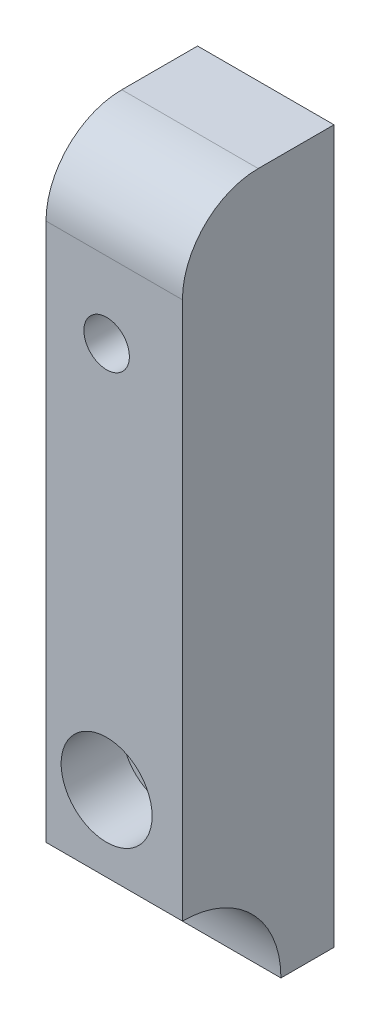
ISO-10303-21;
HEADER;
FILE_DESCRIPTION(('STEP AP214'),'2;1');
FILE_NAME('part.step','',(''),(''),'','','');
FILE_SCHEMA(('AUTOMOTIVE_DESIGN { 1 0 10303 214 1 1 1 1 }'));
ENDSEC;
DATA;
#1=APPLICATION_CONTEXT('core data for automotive mechanical design processes');
#2=APPLICATION_PROTOCOL_DEFINITION('international standard','automotive_design',2000,#1);
#3=PRODUCT_CONTEXT('',#1,'mechanical');
#4=PRODUCT('Part','Part','',(#3));
#5=PRODUCT_RELATED_PRODUCT_CATEGORY('part','',(#4));
#6=PRODUCT_DEFINITION_FORMATION('','',#4);
#7=PRODUCT_DEFINITION_CONTEXT('part definition',#1,'design');
#8=PRODUCT_DEFINITION('design','',#6,#7);
#9=PRODUCT_DEFINITION_SHAPE('','',#8);
#10=(LENGTH_UNIT() NAMED_UNIT(*) SI_UNIT(.MILLI.,.METRE.));
#11=(NAMED_UNIT(*) PLANE_ANGLE_UNIT() SI_UNIT($,.RADIAN.));
#12=(NAMED_UNIT(*) SI_UNIT($,.STERADIAN.) SOLID_ANGLE_UNIT());
#13=UNCERTAINTY_MEASURE_WITH_UNIT(LENGTH_MEASURE(1.E-05),#10,'distance_accuracy_value','');
#14=(GEOMETRIC_REPRESENTATION_CONTEXT(3) GLOBAL_UNCERTAINTY_ASSIGNED_CONTEXT((#13)) GLOBAL_UNIT_ASSIGNED_CONTEXT((#10,
#11,#12)) REPRESENTATION_CONTEXT('',''));
#15=CARTESIAN_POINT('',(0.,0.,0.));
#16=DIRECTION('',(0.,0.,1.));
#17=DIRECTION('',(1.,0.,0.));
#18=AXIS2_PLACEMENT_3D('',#15,#16,#17);
#19=CARTESIAN_POINT('',(5.,11.5,0.));
#20=DIRECTION('',(0.,0.,1.));
#21=DIRECTION('',(1.,0.,0.));
#22=AXIS2_PLACEMENT_3D('',#19,#20,#21);
#23=CYLINDRICAL_SURFACE('',#22,1.5);
#24=CARTESIAN_POINT('',(5.,11.5,0.));
#25=DIRECTION('',(0.,0.,1.));
#26=DIRECTION('',(1.,0.,0.));
#27=AXIS2_PLACEMENT_3D('',#24,#25,#26);
#28=CIRCLE('',#27,1.5);
#29=CARTESIAN_POINT('',(6.5,11.5,0.));
#30=VERTEX_POINT('',#29);
#31=EDGE_CURVE('E112',#30,#30,#28,.T.);
#32=ORIENTED_EDGE('',*,*,#31,.F.);
#33=EDGE_LOOP('',(#32));
#34=FACE_BOUND('',#33,.T.);
#35=CARTESIAN_POINT('',(5.,11.5,6.));
#36=DIRECTION('',(0.,0.,1.));
#37=DIRECTION('',(1.,0.,0.));
#38=AXIS2_PLACEMENT_3D('',#35,#36,#37);
#39=CIRCLE('',#38,1.5);
#40=CARTESIAN_POINT('',(6.5,11.5,6.));
#41=VERTEX_POINT('',#40);
#42=EDGE_CURVE('E36',#41,#41,#39,.F.);
#43=ORIENTED_EDGE('',*,*,#42,.F.);
#44=EDGE_LOOP('',(#43));
#45=FACE_BOUND('',#44,.T.);
#46=ADVANCED_FACE('F32',(#34,#45),#23,.F.);
#47=CARTESIAN_POINT('',(0.,42.,5.));
#48=DIRECTION('',(-1.,0.,0.));
#49=DIRECTION('',(0.,0.,1.));
#50=AXIS2_PLACEMENT_3D('',#47,#48,#49);
#51=CYLINDRICAL_SURFACE('',#50,5.);
#52=DIRECTION('',(-1.,0.,0.));
#53=VECTOR('',#52,1.);
#54=CARTESIAN_POINT('',(0.,47.,5.));
#55=LINE('',#54,#53);
#56=CARTESIAN_POINT('',(1.,47.,5.));
#57=VERTEX_POINT('',#56);
#58=CARTESIAN_POINT('',(10.,47.,5.));
#59=VERTEX_POINT('',#58);
#60=EDGE_CURVE('E41',#57,#59,#55,.F.);
#61=ORIENTED_EDGE('',*,*,#60,.F.);
#62=CARTESIAN_POINT('',(1.,42.,5.));
#63=DIRECTION('',(-1.,0.,0.));
#64=DIRECTION('',(0.,0.,1.));
#65=AXIS2_PLACEMENT_3D('',#62,#63,#64);
#66=CIRCLE('',#65,5.);
#67=CARTESIAN_POINT('',(1.,42.,10.));
#68=VERTEX_POINT('',#67);
#69=EDGE_CURVE('E109',#57,#68,#66,.F.);
#70=ORIENTED_EDGE('',*,*,#69,.T.);
#71=DIRECTION('',(-1.,0.,0.));
#72=VECTOR('',#71,1.);
#73=CARTESIAN_POINT('',(0.,42.,10.));
#74=LINE('',#73,#72);
#75=CARTESIAN_POINT('',(10.,42.,10.));
#76=VERTEX_POINT('',#75);
#77=EDGE_CURVE('E134',#76,#68,#74,.T.);
#78=ORIENTED_EDGE('',*,*,#77,.F.);
#79=CARTESIAN_POINT('',(10.,42.,5.));
#80=DIRECTION('',(-1.,0.,0.));
#81=DIRECTION('',(0.,0.,1.));
#82=AXIS2_PLACEMENT_3D('',#79,#80,#81);
#83=CIRCLE('',#82,5.);
#84=EDGE_CURVE('E11',#59,#76,#83,.F.);
#85=ORIENTED_EDGE('',*,*,#84,.F.);
#86=EDGE_LOOP('',(#61,#70,#78,#85));
#87=FACE_BOUND('',#86,.T.);
#88=ADVANCED_FACE('F34',(#87),#51,.T.);
#89=CARTESIAN_POINT('',(0.,0.,10.));
#90=DIRECTION('',(0.,1.,0.));
#91=DIRECTION('',(0.,0.,1.));
#92=AXIS2_PLACEMENT_3D('',#89,#90,#91);
#93=PLANE('',#92);
#94=DIRECTION('',(0.,0.,-1.));
#95=VECTOR('',#94,1.);
#96=CARTESIAN_POINT('',(10.,0.,10.));
#97=LINE('',#96,#95);
#98=CARTESIAN_POINT('',(10.,0.,3.5));
#99=VERTEX_POINT('',#98);
#100=CARTESIAN_POINT('',(10.,0.,0.));
#101=VERTEX_POINT('',#100);
#102=EDGE_CURVE('E99',#99,#101,#97,.T.);
#103=ORIENTED_EDGE('',*,*,#102,.F.);
#104=DIRECTION('',(-1.,0.,0.));
#105=VECTOR('',#104,1.);
#106=CARTESIAN_POINT('',(23.,0.,3.5));
#107=LINE('',#106,#105);
#108=CARTESIAN_POINT('',(1.,0.,3.5));
#109=VERTEX_POINT('',#108);
#110=EDGE_CURVE('E86',#99,#109,#107,.T.);
#111=ORIENTED_EDGE('',*,*,#110,.T.);
#112=DIRECTION('',(0.,0.,1.));
#113=VECTOR('',#112,1.);
#114=CARTESIAN_POINT('',(1.,0.,0.));
#115=LINE('',#114,#113);
#116=CARTESIAN_POINT('',(1.,0.,0.));
#117=VERTEX_POINT('',#116);
#118=EDGE_CURVE('E97',#117,#109,#115,.T.);
#119=ORIENTED_EDGE('',*,*,#118,.F.);
#120=DIRECTION('',(1.,0.,0.));
#121=VECTOR('',#120,1.);
#122=CARTESIAN_POINT('',(0.,0.,0.));
#123=LINE('',#122,#121);
#124=EDGE_CURVE('E119',#117,#101,#123,.T.);
#125=ORIENTED_EDGE('',*,*,#124,.T.);
#126=EDGE_LOOP('',(#103,#111,#119,#125));
#127=FACE_BOUND('',#126,.T.);
#128=ADVANCED_FACE('F95',(#127),#93,.F.);
#129=CARTESIAN_POINT('',(0.,47.,10.));
#130=DIRECTION('',(0.,-1.,0.));
#131=DIRECTION('',(0.,0.,-1.));
#132=AXIS2_PLACEMENT_3D('',#129,#130,#131);
#133=PLANE('',#132);
#134=DIRECTION('',(0.,0.,-1.));
#135=VECTOR('',#134,1.);
#136=CARTESIAN_POINT('',(1.,47.,0.));
#137=LINE('',#136,#135);
#138=CARTESIAN_POINT('',(1.,47.,0.));
#139=VERTEX_POINT('',#138);
#140=EDGE_CURVE('E56',#57,#139,#137,.T.);
#141=ORIENTED_EDGE('',*,*,#140,.F.);
#142=ORIENTED_EDGE('',*,*,#60,.T.);
#143=DIRECTION('',(0.,0.,-1.));
#144=VECTOR('',#143,1.);
#145=CARTESIAN_POINT('',(10.,47.,10.));
#146=LINE('',#145,#144);
#147=CARTESIAN_POINT('',(10.,47.,0.));
#148=VERTEX_POINT('',#147);
#149=EDGE_CURVE('E124',#59,#148,#146,.T.);
#150=ORIENTED_EDGE('',*,*,#149,.T.);
#151=DIRECTION('',(-1.,0.,0.));
#152=VECTOR('',#151,1.);
#153=CARTESIAN_POINT('',(0.,47.,0.));
#154=LINE('',#153,#152);
#155=EDGE_CURVE('E125',#148,#139,#154,.T.);
#156=ORIENTED_EDGE('',*,*,#155,.T.);
#157=EDGE_LOOP('',(#141,#142,#150,#156));
#158=FACE_BOUND('',#157,.T.);
#159=ADVANCED_FACE('F140',(#158),#133,.F.);
#160=CARTESIAN_POINT('',(0.,0.,10.));
#161=DIRECTION('',(0.,0.,-1.));
#162=DIRECTION('',(-1.,0.,0.));
#163=AXIS2_PLACEMENT_3D('',#160,#161,#162);
#164=PLANE('',#163);
#165=CARTESIAN_POINT('',(5.,11.5,10.));
#166=DIRECTION('',(0.,0.,1.));
#167=DIRECTION('',(1.,0.,0.));
#168=AXIS2_PLACEMENT_3D('',#165,#166,#167);
#169=CIRCLE('',#168,3.);
#170=CARTESIAN_POINT('',(8.,11.5,10.));
#171=VERTEX_POINT('',#170);
#172=EDGE_CURVE('E189',#171,#171,#169,.T.);
#173=ORIENTED_EDGE('',*,*,#172,.F.);
#174=EDGE_LOOP('',(#173));
#175=FACE_BOUND('',#174,.T.);
#176=CARTESIAN_POINT('',(5.,37.,10.));
#177=DIRECTION('',(0.,0.,1.));
#178=DIRECTION('',(1.,0.,0.));
#179=AXIS2_PLACEMENT_3D('',#176,#177,#178);
#180=CIRCLE('',#179,1.5);
#181=CARTESIAN_POINT('',(6.5,37.,10.));
#182=VERTEX_POINT('',#181);
#183=EDGE_CURVE('E115',#182,#182,#180,.T.);
#184=ORIENTED_EDGE('',*,*,#183,.F.);
#185=EDGE_LOOP('',(#184));
#186=FACE_BOUND('',#185,.T.);
#187=DIRECTION('',(0.,1.,0.));
#188=VECTOR('',#187,1.);
#189=CARTESIAN_POINT('',(1.,47.,10.));
#190=LINE('',#189,#188);
#191=CARTESIAN_POINT('',(1.,6.5,10.));
#192=VERTEX_POINT('',#191);
#193=EDGE_CURVE('E103',#192,#68,#190,.T.);
#194=ORIENTED_EDGE('',*,*,#193,.F.);
#195=DIRECTION('',(-1.,0.,0.));
#196=VECTOR('',#195,1.);
#197=CARTESIAN_POINT('',(23.,6.5,10.));
#198=LINE('',#197,#196);
#199=CARTESIAN_POINT('',(10.,6.5,10.));
#200=VERTEX_POINT('',#199);
#201=EDGE_CURVE('E48',#192,#200,#198,.F.);
#202=ORIENTED_EDGE('',*,*,#201,.T.);
#203=DIRECTION('',(0.,1.,0.));
#204=VECTOR('',#203,1.);
#205=CARTESIAN_POINT('',(10.,0.,10.));
#206=LINE('',#205,#204);
#207=EDGE_CURVE('E122',#200,#76,#206,.T.);
#208=ORIENTED_EDGE('',*,*,#207,.T.);
#209=ORIENTED_EDGE('',*,*,#77,.T.);
#210=EDGE_LOOP('',(#194,#202,#208,#209));
#211=FACE_BOUND('',#210,.T.);
#212=ADVANCED_FACE('F152',(#175,#186,#211),#164,.F.);
#213=CARTESIAN_POINT('',(0.,0.,0.));
#214=DIRECTION('',(0.,0.,-1.));
#215=DIRECTION('',(-1.,0.,0.));
#216=AXIS2_PLACEMENT_3D('',#213,#214,#215);
#217=PLANE('',#216);
#218=ORIENTED_EDGE('',*,*,#31,.T.);
#219=EDGE_LOOP('',(#218));
#220=FACE_BOUND('',#219,.T.);
#221=CARTESIAN_POINT('',(5.,37.,0.));
#222=DIRECTION('',(0.,0.,1.));
#223=DIRECTION('',(1.,0.,0.));
#224=AXIS2_PLACEMENT_3D('',#221,#222,#223);
#225=CIRCLE('',#224,1.5);
#226=CARTESIAN_POINT('',(6.5,37.,0.));
#227=VERTEX_POINT('',#226);
#228=EDGE_CURVE('E116',#227,#227,#225,.T.);
#229=ORIENTED_EDGE('',*,*,#228,.T.);
#230=EDGE_LOOP('',(#229));
#231=FACE_BOUND('',#230,.T.);
#232=ORIENTED_EDGE('',*,*,#124,.F.);
#233=DIRECTION('',(0.,-1.,0.));
#234=VECTOR('',#233,1.);
#235=CARTESIAN_POINT('',(1.,47.,0.));
#236=LINE('',#235,#234);
#237=EDGE_CURVE('E100',#139,#117,#236,.T.);
#238=ORIENTED_EDGE('',*,*,#237,.F.);
#239=ORIENTED_EDGE('',*,*,#155,.F.);
#240=DIRECTION('',(0.,1.,0.));
#241=VECTOR('',#240,1.);
#242=CARTESIAN_POINT('',(10.,0.,0.));
#243=LINE('',#242,#241);
#244=EDGE_CURVE('E127',#101,#148,#243,.T.);
#245=ORIENTED_EDGE('',*,*,#244,.F.);
#246=EDGE_LOOP('',(#232,#238,#239,#245));
#247=FACE_BOUND('',#246,.T.);
#248=ADVANCED_FACE('F150',(#220,#231,#247),#217,.T.);
#249=CARTESIAN_POINT('',(10.,0.,10.));
#250=DIRECTION('',(-1.,0.,0.));
#251=DIRECTION('',(0.,0.,1.));
#252=AXIS2_PLACEMENT_3D('',#249,#250,#251);
#253=PLANE('',#252);
#254=ORIENTED_EDGE('',*,*,#207,.F.);
#255=CARTESIAN_POINT('',(10.,0.,10.));
#256=DIRECTION('',(-1.,0.,0.));
#257=DIRECTION('',(0.,0.,1.));
#258=AXIS2_PLACEMENT_3D('',#255,#256,#257);
#259=CIRCLE('',#258,6.5);
#260=EDGE_CURVE('E90',#200,#99,#259,.T.);
#261=ORIENTED_EDGE('',*,*,#260,.T.);
#262=ORIENTED_EDGE('',*,*,#102,.T.);
#263=ORIENTED_EDGE('',*,*,#244,.T.);
#264=ORIENTED_EDGE('',*,*,#149,.F.);
#265=ORIENTED_EDGE('',*,*,#84,.T.);
#266=EDGE_LOOP('',(#254,#261,#262,#263,#264,#265));
#267=FACE_BOUND('',#266,.T.);
#268=ADVANCED_FACE('F146',(#267),#253,.F.);
#269=CARTESIAN_POINT('',(5.,37.,0.));
#270=DIRECTION('',(0.,0.,1.));
#271=DIRECTION('',(1.,0.,0.));
#272=AXIS2_PLACEMENT_3D('',#269,#270,#271);
#273=CYLINDRICAL_SURFACE('',#272,1.5);
#274=ORIENTED_EDGE('',*,*,#228,.F.);
#275=EDGE_LOOP('',(#274));
#276=FACE_BOUND('',#275,.T.);
#277=ORIENTED_EDGE('',*,*,#183,.T.);
#278=EDGE_LOOP('',(#277));
#279=FACE_BOUND('',#278,.T.);
#280=ADVANCED_FACE('F159',(#276,#279),#273,.F.);
#281=CARTESIAN_POINT('',(1.,0.,0.));
#282=DIRECTION('',(-1.,0.,0.));
#283=DIRECTION('',(0.,0.,1.));
#284=AXIS2_PLACEMENT_3D('',#281,#282,#283);
#285=PLANE('',#284);
#286=CARTESIAN_POINT('',(1.,0.,10.));
#287=DIRECTION('',(-1.,0.,0.));
#288=DIRECTION('',(0.,0.,1.));
#289=AXIS2_PLACEMENT_3D('',#286,#287,#288);
#290=CIRCLE('',#289,6.5);
#291=EDGE_CURVE('E83',#192,#109,#290,.T.);
#292=ORIENTED_EDGE('',*,*,#291,.F.);
#293=ORIENTED_EDGE('',*,*,#193,.T.);
#294=ORIENTED_EDGE('',*,*,#69,.F.);
#295=ORIENTED_EDGE('',*,*,#140,.T.);
#296=ORIENTED_EDGE('',*,*,#237,.T.);
#297=ORIENTED_EDGE('',*,*,#118,.T.);
#298=EDGE_LOOP('',(#292,#293,#294,#295,#296,#297));
#299=FACE_BOUND('',#298,.T.);
#300=ADVANCED_FACE('F102',(#299),#285,.T.);
#301=CARTESIAN_POINT('',(23.,0.,10.));
#302=DIRECTION('',(-1.,0.,0.));
#303=DIRECTION('',(0.,0.,1.));
#304=AXIS2_PLACEMENT_3D('',#301,#302,#303);
#305=CYLINDRICAL_SURFACE('',#304,6.5);
#306=ORIENTED_EDGE('',*,*,#260,.F.);
#307=ORIENTED_EDGE('',*,*,#201,.F.);
#308=ORIENTED_EDGE('',*,*,#291,.T.);
#309=ORIENTED_EDGE('',*,*,#110,.F.);
#310=EDGE_LOOP('',(#306,#307,#308,#309));
#311=FACE_BOUND('',#310,.T.);
#312=ADVANCED_FACE('F85',(#311),#305,.F.);
#313=CARTESIAN_POINT('',(5.,11.5,6.));
#314=DIRECTION('',(0.,0.,1.));
#315=DIRECTION('',(1.,0.,0.));
#316=AXIS2_PLACEMENT_3D('',#313,#314,#315);
#317=PLANE('',#316);
#318=CARTESIAN_POINT('',(5.,11.5,6.));
#319=DIRECTION('',(0.,0.,1.));
#320=DIRECTION('',(1.,0.,0.));
#321=AXIS2_PLACEMENT_3D('',#318,#319,#320);
#322=CIRCLE('',#321,3.);
#323=CARTESIAN_POINT('',(8.,11.5,6.));
#324=VERTEX_POINT('',#323);
#325=EDGE_CURVE('E192',#324,#324,#322,.T.);
#326=ORIENTED_EDGE('',*,*,#325,.T.);
#327=EDGE_LOOP('',(#326));
#328=FACE_BOUND('',#327,.T.);
#329=ORIENTED_EDGE('',*,*,#42,.T.);
#330=EDGE_LOOP('',(#329));
#331=FACE_BOUND('',#330,.T.);
#332=ADVANCED_FACE('F199',(#328,#331),#317,.T.);
#333=CARTESIAN_POINT('',(5.,11.5,6.));
#334=DIRECTION('',(0.,0.,1.));
#335=DIRECTION('',(1.,0.,0.));
#336=AXIS2_PLACEMENT_3D('',#333,#334,#335);
#337=CYLINDRICAL_SURFACE('',#336,3.);
#338=ORIENTED_EDGE('',*,*,#325,.F.);
#339=EDGE_LOOP('',(#338));
#340=FACE_BOUND('',#339,.T.);
#341=ORIENTED_EDGE('',*,*,#172,.T.);
#342=EDGE_LOOP('',(#341));
#343=FACE_BOUND('',#342,.T.);
#344=ADVANCED_FACE('F201',(#340,#343),#337,.F.);
#345=CLOSED_SHELL('',(#46,#88,#128,#159,#212,#248,#268,#280,#300,#312,#332,#344));
#346=MANIFOLD_SOLID_BREP('B2',#345);
#347=ADVANCED_BREP_SHAPE_REPRESENTATION('',(#18,#346),#14);
#348=SHAPE_DEFINITION_REPRESENTATION(#9,#347);
ENDSEC;
END-ISO-10303-21;
